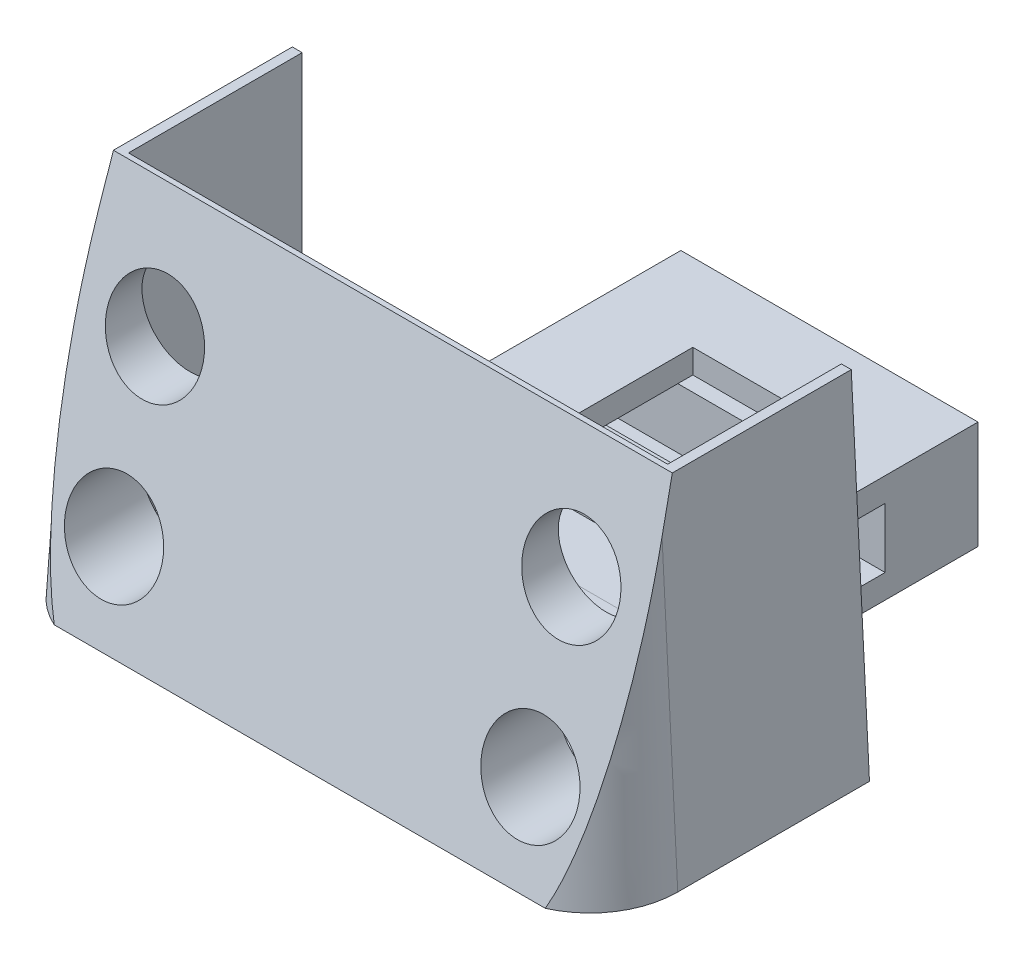
ISO-10303-21;
HEADER;
FILE_DESCRIPTION(('STEP AP214'),'2;1');
FILE_NAME('part.step','',(''),(''),'','','');
FILE_SCHEMA(('AUTOMOTIVE_DESIGN { 1 0 10303 214 1 1 1 1 }'));
ENDSEC;
DATA;
#1=APPLICATION_CONTEXT('core data for automotive mechanical design processes');
#2=APPLICATION_PROTOCOL_DEFINITION('international standard','automotive_design',2000,#1);
#3=PRODUCT_CONTEXT('',#1,'mechanical');
#4=PRODUCT('Part','Part','',(#3));
#5=PRODUCT_RELATED_PRODUCT_CATEGORY('part','',(#4));
#6=PRODUCT_DEFINITION_FORMATION('','',#4);
#7=PRODUCT_DEFINITION_CONTEXT('part definition',#1,'design');
#8=PRODUCT_DEFINITION('design','',#6,#7);
#9=PRODUCT_DEFINITION_SHAPE('','',#8);
#10=(LENGTH_UNIT() NAMED_UNIT(*) SI_UNIT(.MILLI.,.METRE.));
#11=(NAMED_UNIT(*) PLANE_ANGLE_UNIT() SI_UNIT($,.RADIAN.));
#12=(NAMED_UNIT(*) SI_UNIT($,.STERADIAN.) SOLID_ANGLE_UNIT());
#13=UNCERTAINTY_MEASURE_WITH_UNIT(LENGTH_MEASURE(1.E-05),#10,'distance_accuracy_value','');
#14=(GEOMETRIC_REPRESENTATION_CONTEXT(3) GLOBAL_UNCERTAINTY_ASSIGNED_CONTEXT((#13)) GLOBAL_UNIT_ASSIGNED_CONTEXT((#10,
#11,#12)) REPRESENTATION_CONTEXT('',''));
#15=CARTESIAN_POINT('',(0.,0.,0.));
#16=DIRECTION('',(0.,0.,1.));
#17=DIRECTION('',(1.,0.,0.));
#18=AXIS2_PLACEMENT_3D('',#15,#16,#17);
#19=CARTESIAN_POINT('',(-24.8,5.98999999999997,3.00000000000001));
#20=DIRECTION('',(0.,0.,1.));
#21=DIRECTION('',(1.,0.,0.));
#22=AXIS2_PLACEMENT_3D('',#19,#20,#21);
#23=PLANE('',#22);
#24=DIRECTION('',(0.,1.,0.));
#25=VECTOR('',#24,1.);
#26=CARTESIAN_POINT('',(24.8,0.,3.00000000000001));
#27=LINE('',#26,#25);
#28=CARTESIAN_POINT('',(24.8,5.99999999999999,3.00000000000001));
#29=VERTEX_POINT('',#28);
#30=CARTESIAN_POINT('',(24.8,10.,3.00000000000001));
#31=VERTEX_POINT('',#30);
#32=EDGE_CURVE('E58',#29,#31,#27,.T.);
#33=ORIENTED_EDGE('',*,*,#32,.T.);
#34=DIRECTION('',(-1.,0.,0.));
#35=VECTOR('',#34,1.);
#36=CARTESIAN_POINT('',(-35.,10.,3.00000000000001));
#37=LINE('',#36,#35);
#38=CARTESIAN_POINT('',(-24.8,10.,3.00000000000001));
#39=VERTEX_POINT('',#38);
#40=EDGE_CURVE('E187',#31,#39,#37,.T.);
#41=ORIENTED_EDGE('',*,*,#40,.T.);
#42=DIRECTION('',(0.,1.,0.));
#43=VECTOR('',#42,1.);
#44=CARTESIAN_POINT('',(-24.8,0.,3.00000000000001));
#45=LINE('',#44,#43);
#46=CARTESIAN_POINT('',(-24.8,5.99999999999999,3.00000000000001));
#47=VERTEX_POINT('',#46);
#48=EDGE_CURVE('E72',#47,#39,#45,.T.);
#49=ORIENTED_EDGE('',*,*,#48,.F.);
#50=DIRECTION('',(1.,0.,0.));
#51=VECTOR('',#50,1.);
#52=CARTESIAN_POINT('',(-50.,5.99999999999999,3.00000000000001));
#53=LINE('',#52,#51);
#54=EDGE_CURVE('E191',#47,#29,#53,.T.);
#55=ORIENTED_EDGE('',*,*,#54,.T.);
#56=EDGE_LOOP('',(#33,#41,#49,#55));
#57=FACE_BOUND('',#56,.T.);
#58=ADVANCED_FACE('F54',(#57),#23,.T.);
#59=CARTESIAN_POINT('',(-35.,10.,-35.));
#60=DIRECTION('',(0.,-1.,0.));
#61=DIRECTION('',(0.,0.,-1.));
#62=AXIS2_PLACEMENT_3D('',#59,#60,#61);
#63=PLANE('',#62);
#64=ORIENTED_EDGE('',*,*,#40,.F.);
#65=DIRECTION('',(0.,0.,-1.));
#66=VECTOR('',#65,1.);
#67=CARTESIAN_POINT('',(24.8,10.,3.));
#68=LINE('',#67,#66);
#69=CARTESIAN_POINT('',(24.8,10.,-7.49999999999999));
#70=VERTEX_POINT('',#69);
#71=EDGE_CURVE('E175',#31,#70,#68,.T.);
#72=ORIENTED_EDGE('',*,*,#71,.T.);
#73=DIRECTION('',(-1.,0.,0.));
#74=VECTOR('',#73,1.);
#75=CARTESIAN_POINT('',(15.,10.,-7.49999999999999));
#76=LINE('',#75,#74);
#77=CARTESIAN_POINT('',(-24.8,10.,-7.49999999999998));
#78=VERTEX_POINT('',#77);
#79=EDGE_CURVE('E222',#70,#78,#76,.T.);
#80=ORIENTED_EDGE('',*,*,#79,.T.);
#81=DIRECTION('',(0.,0.,1.));
#82=VECTOR('',#81,1.);
#83=CARTESIAN_POINT('',(-24.8,10.,3.));
#84=LINE('',#83,#82);
#85=EDGE_CURVE('E64',#78,#39,#84,.T.);
#86=ORIENTED_EDGE('',*,*,#85,.T.);
#87=EDGE_LOOP('',(#64,#72,#80,#86));
#88=FACE_BOUND('',#87,.T.);
#89=ADVANCED_FACE('F188',(#88),#63,.F.);
#90=CARTESIAN_POINT('',(-50.,6.,-40.));
#91=DIRECTION('',(0.,1.,0.));
#92=DIRECTION('',(0.,0.,1.));
#93=AXIS2_PLACEMENT_3D('',#90,#91,#92);
#94=PLANE('',#93);
#95=ORIENTED_EDGE('',*,*,#54,.F.);
#96=DIRECTION('',(0.,0.,1.));
#97=VECTOR('',#96,1.);
#98=CARTESIAN_POINT('',(-24.8,6.,-40.));
#99=LINE('',#98,#97);
#100=CARTESIAN_POINT('',(-24.8,6.00000000000001,-40.));
#101=VERTEX_POINT('',#100);
#102=EDGE_CURVE('E220',#101,#47,#99,.T.);
#103=ORIENTED_EDGE('',*,*,#102,.F.);
#104=DIRECTION('',(-1.,0.,0.));
#105=VECTOR('',#104,1.);
#106=CARTESIAN_POINT('',(-50.,6.00000000000001,-40.));
#107=LINE('',#106,#105);
#108=CARTESIAN_POINT('',(24.8,6.,-40.));
#109=VERTEX_POINT('',#108);
#110=EDGE_CURVE('E190',#109,#101,#107,.T.);
#111=ORIENTED_EDGE('',*,*,#110,.F.);
#112=DIRECTION('',(0.,0.,-1.));
#113=VECTOR('',#112,1.);
#114=CARTESIAN_POINT('',(24.8,6.,-40.));
#115=LINE('',#114,#113);
#116=EDGE_CURVE('E218',#29,#109,#115,.T.);
#117=ORIENTED_EDGE('',*,*,#116,.F.);
#118=EDGE_LOOP('',(#95,#103,#111,#117));
#119=FACE_BOUND('',#118,.T.);
#120=ADVANCED_FACE('F56',(#119),#94,.F.);
#121=CARTESIAN_POINT('',(-24.8,20.,-7.49999999999999));
#122=DIRECTION('',(0.,0.,-1.));
#123=DIRECTION('',(-1.,0.,0.));
#124=AXIS2_PLACEMENT_3D('',#121,#122,#123);
#125=PLANE('',#124);
#126=ORIENTED_EDGE('',*,*,#79,.F.);
#127=DIRECTION('',(0.,1.,0.));
#128=VECTOR('',#127,1.);
#129=CARTESIAN_POINT('',(24.8,-40.6992110392263,-7.5));
#130=LINE('',#129,#128);
#131=CARTESIAN_POINT('',(24.8,24.,-7.49999999999999));
#132=VERTEX_POINT('',#131);
#133=EDGE_CURVE('E183',#70,#132,#130,.T.);
#134=ORIENTED_EDGE('',*,*,#133,.T.);
#135=DIRECTION('',(-1.,0.,0.));
#136=VECTOR('',#135,1.);
#137=CARTESIAN_POINT('',(-24.8,24.,-7.49999999999999));
#138=LINE('',#137,#136);
#139=CARTESIAN_POINT('',(9.80000000000002,24.,-7.49999999999999));
#140=VERTEX_POINT('',#139);
#141=EDGE_CURVE('E212',#132,#140,#138,.T.);
#142=ORIENTED_EDGE('',*,*,#141,.T.);
#143=DIRECTION('',(0.,-1.,0.));
#144=VECTOR('',#143,1.);
#145=CARTESIAN_POINT('',(9.80000000000002,25.,-7.49999999999999));
#146=LINE('',#145,#144);
#147=CARTESIAN_POINT('',(9.80000000000002,20.,-7.49999999999999));
#148=VERTEX_POINT('',#147);
#149=EDGE_CURVE('E232',#140,#148,#146,.T.);
#150=ORIENTED_EDGE('',*,*,#149,.T.);
#151=DIRECTION('',(1.,0.,0.));
#152=VECTOR('',#151,1.);
#153=CARTESIAN_POINT('',(-24.8,20.,-7.49999999999999));
#154=LINE('',#153,#152);
#155=CARTESIAN_POINT('',(-9.8,20.,-7.49999999999999));
#156=VERTEX_POINT('',#155);
#157=EDGE_CURVE('E262',#156,#148,#154,.T.);
#158=ORIENTED_EDGE('',*,*,#157,.F.);
#159=DIRECTION('',(0.,-1.,0.));
#160=VECTOR('',#159,1.);
#161=CARTESIAN_POINT('',(-9.8,25.,-7.49999999999999));
#162=LINE('',#161,#160);
#163=CARTESIAN_POINT('',(-9.8,24.,-7.49999999999999));
#164=VERTEX_POINT('',#163);
#165=EDGE_CURVE('E252',#164,#156,#162,.T.);
#166=ORIENTED_EDGE('',*,*,#165,.F.);
#167=CARTESIAN_POINT('',(-24.8,24.,-7.49999999999998));
#168=VERTEX_POINT('',#167);
#169=EDGE_CURVE('E85',#164,#168,#138,.T.);
#170=ORIENTED_EDGE('',*,*,#169,.T.);
#171=DIRECTION('',(0.,1.,0.));
#172=VECTOR('',#171,1.);
#173=CARTESIAN_POINT('',(-24.8,-40.6992110392263,-7.49999999999999));
#174=LINE('',#173,#172);
#175=EDGE_CURVE('E12',#78,#168,#174,.T.);
#176=ORIENTED_EDGE('',*,*,#175,.F.);
#177=EDGE_LOOP('',(#126,#134,#142,#150,#158,#166,#170,#176));
#178=FACE_BOUND('',#177,.T.);
#179=ADVANCED_FACE('F301',(#178),#125,.F.);
#180=CARTESIAN_POINT('',(-24.8,89.2753352012447,-27.));
#181=DIRECTION('',(0.,0.,-1.));
#182=DIRECTION('',(-1.,0.,0.));
#183=AXIS2_PLACEMENT_3D('',#180,#181,#182);
#184=PLANE('',#183);
#185=DIRECTION('',(0.,1.,0.));
#186=VECTOR('',#185,1.);
#187=CARTESIAN_POINT('',(9.80000000000002,20.,-27.));
#188=LINE('',#187,#186);
#189=CARTESIAN_POINT('',(9.80000000000002,20.,-27.));
#190=VERTEX_POINT('',#189);
#191=CARTESIAN_POINT('',(9.80000000000002,24.,-27.));
#192=VERTEX_POINT('',#191);
#193=EDGE_CURVE('E224',#190,#192,#188,.T.);
#194=ORIENTED_EDGE('',*,*,#193,.T.);
#195=DIRECTION('',(-1.,0.,0.));
#196=VECTOR('',#195,1.);
#197=CARTESIAN_POINT('',(-24.8,24.,-27.));
#198=LINE('',#197,#196);
#199=CARTESIAN_POINT('',(-9.80000000000001,24.,-27.));
#200=VERTEX_POINT('',#199);
#201=EDGE_CURVE('E209',#192,#200,#198,.T.);
#202=ORIENTED_EDGE('',*,*,#201,.T.);
#203=DIRECTION('',(0.,-1.,0.));
#204=VECTOR('',#203,1.);
#205=CARTESIAN_POINT('',(-9.80000000000001,25.,-27.));
#206=LINE('',#205,#204);
#207=CARTESIAN_POINT('',(-9.80000000000001,20.,-27.));
#208=VERTEX_POINT('',#207);
#209=EDGE_CURVE('E227',#200,#208,#206,.T.);
#210=ORIENTED_EDGE('',*,*,#209,.T.);
#211=DIRECTION('',(1.,0.,0.));
#212=VECTOR('',#211,1.);
#213=CARTESIAN_POINT('',(-9.80000000000001,20.,-27.));
#214=LINE('',#213,#212);
#215=EDGE_CURVE('E229',#208,#190,#214,.T.);
#216=ORIENTED_EDGE('',*,*,#215,.T.);
#217=EDGE_LOOP('',(#194,#202,#210,#216));
#218=FACE_BOUND('',#217,.T.);
#219=ADVANCED_FACE('F346',(#218),#184,.F.);
#220=CARTESIAN_POINT('',(0.,20.,0.));
#221=DIRECTION('',(0.,1.,0.));
#222=DIRECTION('',(0.,0.,1.));
#223=AXIS2_PLACEMENT_3D('',#220,#221,#222);
#224=PLANE('',#223);
#225=DIRECTION('',(0.,0.,1.));
#226=VECTOR('',#225,1.);
#227=CARTESIAN_POINT('',(9.80000000000002,20.,-29.5));
#228=LINE('',#227,#226);
#229=CARTESIAN_POINT('',(9.80000000000002,20.,-24.5));
#230=VERTEX_POINT('',#229);
#231=EDGE_CURVE('E235',#190,#230,#228,.T.);
#232=ORIENTED_EDGE('',*,*,#231,.F.);
#233=ORIENTED_EDGE('',*,*,#215,.F.);
#234=DIRECTION('',(0.,0.,-1.));
#235=VECTOR('',#234,1.);
#236=CARTESIAN_POINT('',(-9.80000000000001,20.,-29.5));
#237=LINE('',#236,#235);
#238=CARTESIAN_POINT('',(-9.80000000000001,20.,-24.5));
#239=VERTEX_POINT('',#238);
#240=EDGE_CURVE('E247',#239,#208,#237,.T.);
#241=ORIENTED_EDGE('',*,*,#240,.F.);
#242=DIRECTION('',(1.,0.,0.));
#243=VECTOR('',#242,1.);
#244=CARTESIAN_POINT('',(-24.8,20.,-24.5));
#245=LINE('',#244,#243);
#246=EDGE_CURVE('E273',#239,#230,#245,.T.);
#247=ORIENTED_EDGE('',*,*,#246,.T.);
#248=EDGE_LOOP('',(#232,#233,#241,#247));
#249=FACE_BOUND('',#248,.T.);
#250=ADVANCED_FACE('F344',(#249),#224,.T.);
#251=CARTESIAN_POINT('',(-9.80000000000001,25.,-29.5));
#252=DIRECTION('',(-1.,0.,0.));
#253=DIRECTION('',(0.,0.,1.));
#254=AXIS2_PLACEMENT_3D('',#251,#252,#253);
#255=PLANE('',#254);
#256=ORIENTED_EDGE('',*,*,#209,.F.);
#257=DIRECTION('',(0.,0.,1.));
#258=VECTOR('',#257,1.);
#259=CARTESIAN_POINT('',(-9.80000000000001,24.,-29.5));
#260=LINE('',#259,#258);
#261=EDGE_CURVE('E215',#200,#164,#260,.T.);
#262=ORIENTED_EDGE('',*,*,#261,.T.);
#263=ORIENTED_EDGE('',*,*,#165,.T.);
#264=CARTESIAN_POINT('',(-9.8,20.,-12.5));
#265=VERTEX_POINT('',#264);
#266=EDGE_CURVE('E248',#156,#265,#237,.T.);
#267=ORIENTED_EDGE('',*,*,#266,.T.);
#268=EDGE_CURVE('E251',#265,#239,#237,.T.);
#269=ORIENTED_EDGE('',*,*,#268,.T.);
#270=ORIENTED_EDGE('',*,*,#240,.T.);
#271=EDGE_LOOP('',(#256,#262,#263,#267,#269,#270));
#272=FACE_BOUND('',#271,.T.);
#273=ADVANCED_FACE('F304',(#272),#255,.F.);
#274=CARTESIAN_POINT('',(9.80000000000002,25.,-29.5));
#275=DIRECTION('',(1.,0.,0.));
#276=DIRECTION('',(0.,0.,-1.));
#277=AXIS2_PLACEMENT_3D('',#274,#275,#276);
#278=PLANE('',#277);
#279=ORIENTED_EDGE('',*,*,#149,.F.);
#280=DIRECTION('',(0.,0.,-1.));
#281=VECTOR('',#280,1.);
#282=CARTESIAN_POINT('',(9.80000000000002,24.,-29.5));
#283=LINE('',#282,#281);
#284=EDGE_CURVE('E206',#140,#192,#283,.T.);
#285=ORIENTED_EDGE('',*,*,#284,.T.);
#286=ORIENTED_EDGE('',*,*,#193,.F.);
#287=ORIENTED_EDGE('',*,*,#231,.T.);
#288=CARTESIAN_POINT('',(9.80000000000002,20.,-12.5));
#289=VERTEX_POINT('',#288);
#290=EDGE_CURVE('E237',#230,#289,#228,.T.);
#291=ORIENTED_EDGE('',*,*,#290,.T.);
#292=EDGE_CURVE('E234',#289,#148,#228,.T.);
#293=ORIENTED_EDGE('',*,*,#292,.T.);
#294=EDGE_LOOP('',(#279,#285,#286,#287,#291,#293));
#295=FACE_BOUND('',#294,.T.);
#296=ADVANCED_FACE('F314',(#295),#278,.F.);
#297=CARTESIAN_POINT('',(0.,20.,0.));
#298=DIRECTION('',(0.,1.,0.));
#299=DIRECTION('',(0.,0.,1.));
#300=AXIS2_PLACEMENT_3D('',#297,#298,#299);
#301=PLANE('',#300);
#302=ORIENTED_EDGE('',*,*,#157,.T.);
#303=ORIENTED_EDGE('',*,*,#292,.F.);
#304=DIRECTION('',(-1.,0.,0.));
#305=VECTOR('',#304,1.);
#306=CARTESIAN_POINT('',(-24.8,20.,-12.5));
#307=LINE('',#306,#305);
#308=EDGE_CURVE('E267',#289,#265,#307,.T.);
#309=ORIENTED_EDGE('',*,*,#308,.T.);
#310=ORIENTED_EDGE('',*,*,#266,.F.);
#311=EDGE_LOOP('',(#302,#303,#309,#310));
#312=FACE_BOUND('',#311,.T.);
#313=ADVANCED_FACE('F311',(#312),#301,.T.);
#314=DIRECTION('',(-1.,0.,0.));
#315=VECTOR('',#314,1.);
#316=CARTESIAN_POINT('',(-24.8,10.,-12.5));
#317=LINE('',#316,#315);
#318=CARTESIAN_POINT('',(24.8,10.,-12.5));
#319=VERTEX_POINT('',#318);
#320=CARTESIAN_POINT('',(-24.8,10.,-12.5));
#321=VERTEX_POINT('',#320);
#322=EDGE_CURVE('E259',#319,#321,#317,.T.);
#323=ORIENTED_EDGE('',*,*,#322,.F.);
#324=DIRECTION('',(0.,0.,1.));
#325=VECTOR('',#324,1.);
#326=CARTESIAN_POINT('',(24.8,10.,-40.));
#327=LINE('',#326,#325);
#328=CARTESIAN_POINT('',(24.8,10.,-24.5));
#329=VERTEX_POINT('',#328);
#330=EDGE_CURVE('E284',#329,#319,#327,.T.);
#331=ORIENTED_EDGE('',*,*,#330,.F.);
#332=DIRECTION('',(1.,0.,0.));
#333=VECTOR('',#332,1.);
#334=CARTESIAN_POINT('',(-24.8,10.,-24.5));
#335=LINE('',#334,#333);
#336=CARTESIAN_POINT('',(-24.8,10.,-24.5));
#337=VERTEX_POINT('',#336);
#338=EDGE_CURVE('E263',#337,#329,#335,.T.);
#339=ORIENTED_EDGE('',*,*,#338,.F.);
#340=DIRECTION('',(0.,0.,-1.));
#341=VECTOR('',#340,1.);
#342=CARTESIAN_POINT('',(-24.8,10.,-40.));
#343=LINE('',#342,#341);
#344=EDGE_CURVE('E282',#321,#337,#343,.T.);
#345=ORIENTED_EDGE('',*,*,#344,.F.);
#346=EDGE_LOOP('',(#323,#331,#339,#345));
#347=FACE_BOUND('',#346,.T.);
#348=ADVANCED_FACE('F337',(#347),#63,.F.);
#349=CARTESIAN_POINT('',(24.8,0.,-40.));
#350=DIRECTION('',(-1.,0.,0.));
#351=DIRECTION('',(0.,0.,1.));
#352=AXIS2_PLACEMENT_3D('',#349,#350,#351);
#353=PLANE('',#352);
#354=ORIENTED_EDGE('',*,*,#133,.F.);
#355=ORIENTED_EDGE('',*,*,#71,.F.);
#356=ORIENTED_EDGE('',*,*,#32,.F.);
#357=ORIENTED_EDGE('',*,*,#116,.T.);
#358=DIRECTION('',(0.,1.,0.));
#359=VECTOR('',#358,1.);
#360=CARTESIAN_POINT('',(24.8,0.,-40.));
#361=LINE('',#360,#359);
#362=CARTESIAN_POINT('',(24.8,24.,-40.));
#363=VERTEX_POINT('',#362);
#364=EDGE_CURVE('E281',#109,#363,#361,.T.);
#365=ORIENTED_EDGE('',*,*,#364,.T.);
#366=DIRECTION('',(0.,0.,1.));
#367=VECTOR('',#366,1.);
#368=CARTESIAN_POINT('',(24.8,24.,-40.));
#369=LINE('',#368,#367);
#370=EDGE_CURVE('E204',#363,#132,#369,.T.);
#371=ORIENTED_EDGE('',*,*,#370,.T.);
#372=EDGE_LOOP('',(#354,#355,#356,#357,#365,#371));
#373=FACE_BOUND('',#372,.T.);
#374=DIRECTION('',(0.,0.,-1.));
#375=VECTOR('',#374,1.);
#376=CARTESIAN_POINT('',(24.8,20.,-29.5));
#377=LINE('',#376,#375);
#378=CARTESIAN_POINT('',(24.8,20.,-12.5));
#379=VERTEX_POINT('',#378);
#380=CARTESIAN_POINT('',(24.8,20.,-24.5));
#381=VERTEX_POINT('',#380);
#382=EDGE_CURVE('E238',#379,#381,#377,.T.);
#383=ORIENTED_EDGE('',*,*,#382,.T.);
#384=DIRECTION('',(0.,-1.,0.));
#385=VECTOR('',#384,1.);
#386=CARTESIAN_POINT('',(24.8,20.,-24.5));
#387=LINE('',#386,#385);
#388=EDGE_CURVE('E274',#381,#329,#387,.T.);
#389=ORIENTED_EDGE('',*,*,#388,.T.);
#390=ORIENTED_EDGE('',*,*,#330,.T.);
#391=DIRECTION('',(0.,-1.,0.));
#392=VECTOR('',#391,1.);
#393=CARTESIAN_POINT('',(24.8,20.,-12.5));
#394=LINE('',#393,#392);
#395=EDGE_CURVE('E254',#379,#319,#394,.T.);
#396=ORIENTED_EDGE('',*,*,#395,.F.);
#397=EDGE_LOOP('',(#383,#389,#390,#396));
#398=FACE_BOUND('',#397,.T.);
#399=ADVANCED_FACE('F177',(#373,#398),#353,.F.);
#400=CARTESIAN_POINT('',(-24.8,0.,-40.));
#401=DIRECTION('',(1.,0.,0.));
#402=DIRECTION('',(0.,0.,-1.));
#403=AXIS2_PLACEMENT_3D('',#400,#401,#402);
#404=PLANE('',#403);
#405=ORIENTED_EDGE('',*,*,#48,.T.);
#406=ORIENTED_EDGE('',*,*,#85,.F.);
#407=ORIENTED_EDGE('',*,*,#175,.T.);
#408=DIRECTION('',(0.,0.,-1.));
#409=VECTOR('',#408,1.);
#410=CARTESIAN_POINT('',(-24.8,24.,-40.));
#411=LINE('',#410,#409);
#412=CARTESIAN_POINT('',(-24.8,24.,-40.));
#413=VERTEX_POINT('',#412);
#414=EDGE_CURVE('E91',#168,#413,#411,.T.);
#415=ORIENTED_EDGE('',*,*,#414,.T.);
#416=DIRECTION('',(0.,1.,0.));
#417=VECTOR('',#416,1.);
#418=CARTESIAN_POINT('',(-24.8,0.,-40.));
#419=LINE('',#418,#417);
#420=EDGE_CURVE('E196',#101,#413,#419,.T.);
#421=ORIENTED_EDGE('',*,*,#420,.F.);
#422=ORIENTED_EDGE('',*,*,#102,.T.);
#423=EDGE_LOOP('',(#405,#406,#407,#415,#421,#422));
#424=FACE_BOUND('',#423,.T.);
#425=DIRECTION('',(0.,-1.,0.));
#426=VECTOR('',#425,1.);
#427=CARTESIAN_POINT('',(-24.8,20.,-24.5));
#428=LINE('',#427,#426);
#429=CARTESIAN_POINT('',(-24.8,20.,-24.5));
#430=VERTEX_POINT('',#429);
#431=EDGE_CURVE('E278',#430,#337,#428,.T.);
#432=ORIENTED_EDGE('',*,*,#431,.F.);
#433=DIRECTION('',(0.,0.,1.));
#434=VECTOR('',#433,1.);
#435=CARTESIAN_POINT('',(-24.8,20.,-29.5));
#436=LINE('',#435,#434);
#437=CARTESIAN_POINT('',(-24.8,20.,-12.5));
#438=VERTEX_POINT('',#437);
#439=EDGE_CURVE('E244',#430,#438,#436,.T.);
#440=ORIENTED_EDGE('',*,*,#439,.T.);
#441=DIRECTION('',(0.,-1.,0.));
#442=VECTOR('',#441,1.);
#443=CARTESIAN_POINT('',(-24.8,20.,-12.5));
#444=LINE('',#443,#442);
#445=EDGE_CURVE('E256',#438,#321,#444,.T.);
#446=ORIENTED_EDGE('',*,*,#445,.T.);
#447=ORIENTED_EDGE('',*,*,#344,.T.);
#448=EDGE_LOOP('',(#432,#440,#446,#447));
#449=FACE_BOUND('',#448,.T.);
#450=ADVANCED_FACE('F296',(#424,#449),#404,.F.);
#451=CARTESIAN_POINT('',(-24.8,20.,-24.5));
#452=DIRECTION('',(0.,0.,-1.));
#453=DIRECTION('',(-1.,0.,0.));
#454=AXIS2_PLACEMENT_3D('',#451,#452,#453);
#455=PLANE('',#454);
#456=ORIENTED_EDGE('',*,*,#338,.T.);
#457=ORIENTED_EDGE('',*,*,#388,.F.);
#458=DIRECTION('',(-1.,0.,0.));
#459=VECTOR('',#458,1.);
#460=CARTESIAN_POINT('',(-24.8,20.,-24.5));
#461=LINE('',#460,#459);
#462=EDGE_CURVE('E241',#381,#230,#461,.T.);
#463=ORIENTED_EDGE('',*,*,#462,.T.);
#464=ORIENTED_EDGE('',*,*,#246,.F.);
#465=EDGE_CURVE('E270',#430,#239,#245,.T.);
#466=ORIENTED_EDGE('',*,*,#465,.F.);
#467=ORIENTED_EDGE('',*,*,#431,.T.);
#468=EDGE_LOOP('',(#456,#457,#463,#464,#466,#467));
#469=FACE_BOUND('',#468,.T.);
#470=ADVANCED_FACE('F339',(#469),#455,.F.);
#471=CARTESIAN_POINT('',(-24.8,20.,-12.5));
#472=DIRECTION('',(0.,0.,1.));
#473=DIRECTION('',(1.,0.,0.));
#474=AXIS2_PLACEMENT_3D('',#471,#472,#473);
#475=PLANE('',#474);
#476=ORIENTED_EDGE('',*,*,#322,.T.);
#477=ORIENTED_EDGE('',*,*,#445,.F.);
#478=EDGE_CURVE('E258',#265,#438,#307,.T.);
#479=ORIENTED_EDGE('',*,*,#478,.F.);
#480=ORIENTED_EDGE('',*,*,#308,.F.);
#481=EDGE_CURVE('E264',#379,#289,#307,.T.);
#482=ORIENTED_EDGE('',*,*,#481,.F.);
#483=ORIENTED_EDGE('',*,*,#395,.T.);
#484=EDGE_LOOP('',(#476,#477,#479,#480,#482,#483));
#485=FACE_BOUND('',#484,.T.);
#486=ADVANCED_FACE('F323',(#485),#475,.F.);
#487=CARTESIAN_POINT('',(0.,20.,0.));
#488=DIRECTION('',(0.,1.,0.));
#489=DIRECTION('',(0.,0.,1.));
#490=AXIS2_PLACEMENT_3D('',#487,#488,#489);
#491=PLANE('',#490);
#492=ORIENTED_EDGE('',*,*,#439,.F.);
#493=ORIENTED_EDGE('',*,*,#465,.T.);
#494=ORIENTED_EDGE('',*,*,#268,.F.);
#495=ORIENTED_EDGE('',*,*,#478,.T.);
#496=EDGE_LOOP('',(#492,#493,#494,#495));
#497=FACE_BOUND('',#496,.T.);
#498=ADVANCED_FACE('F330',(#497),#491,.F.);
#499=CARTESIAN_POINT('',(0.,20.,0.));
#500=DIRECTION('',(0.,-1.,0.));
#501=DIRECTION('',(0.,0.,-1.));
#502=AXIS2_PLACEMENT_3D('',#499,#500,#501);
#503=PLANE('',#502);
#504=ORIENTED_EDGE('',*,*,#462,.F.);
#505=ORIENTED_EDGE('',*,*,#382,.F.);
#506=ORIENTED_EDGE('',*,*,#481,.T.);
#507=ORIENTED_EDGE('',*,*,#290,.F.);
#508=EDGE_LOOP('',(#504,#505,#506,#507));
#509=FACE_BOUND('',#508,.T.);
#510=ADVANCED_FACE('F319',(#509),#503,.T.);
#511=CARTESIAN_POINT('',(-50.,-101.980390271856,-40.));
#512=DIRECTION('',(0.,0.,1.));
#513=DIRECTION('',(1.,0.,0.));
#514=AXIS2_PLACEMENT_3D('',#511,#512,#513);
#515=PLANE('',#514);
#516=ORIENTED_EDGE('',*,*,#420,.T.);
#517=DIRECTION('',(1.,0.,0.));
#518=VECTOR('',#517,1.);
#519=CARTESIAN_POINT('',(-49.6855533243016,24.,-40.));
#520=LINE('',#519,#518);
#521=EDGE_CURVE('E200',#413,#363,#520,.T.);
#522=ORIENTED_EDGE('',*,*,#521,.T.);
#523=ORIENTED_EDGE('',*,*,#364,.F.);
#524=ORIENTED_EDGE('',*,*,#110,.T.);
#525=EDGE_LOOP('',(#516,#522,#523,#524));
#526=FACE_BOUND('',#525,.T.);
#527=ADVANCED_FACE('F294',(#526),#515,.F.);
#528=CARTESIAN_POINT('',(-49.6855533243016,24.,-40.));
#529=DIRECTION('',(0.,-1.,0.));
#530=DIRECTION('',(0.,0.,-1.));
#531=AXIS2_PLACEMENT_3D('',#528,#529,#530);
#532=PLANE('',#531);
#533=ORIENTED_EDGE('',*,*,#414,.F.);
#534=ORIENTED_EDGE('',*,*,#169,.F.);
#535=ORIENTED_EDGE('',*,*,#261,.F.);
#536=ORIENTED_EDGE('',*,*,#201,.F.);
#537=ORIENTED_EDGE('',*,*,#284,.F.);
#538=ORIENTED_EDGE('',*,*,#141,.F.);
#539=ORIENTED_EDGE('',*,*,#370,.F.);
#540=ORIENTED_EDGE('',*,*,#521,.F.);
#541=EDGE_LOOP('',(#533,#534,#535,#536,#537,#538,#539,#540));
#542=FACE_BOUND('',#541,.T.);
#543=ADVANCED_FACE('F299',(#542),#532,.F.);
#544=CLOSED_SHELL('',(#58,#89,#120,#179,#219,#250,#273,#296,#313,#348,#399,#450,#470,#486,#498,
#510,#527,#543));
#545=MANIFOLD_SOLID_BREP('B2',#544);
#546=CARTESIAN_POINT('',(34.75,45.5,50.));
#547=DIRECTION('',(0.,0.,-1.));
#548=DIRECTION('',(-1.,0.,0.));
#549=AXIS2_PLACEMENT_3D('',#546,#547,#548);
#550=CYLINDRICAL_SURFACE('',#549,8.);
#551=CARTESIAN_POINT('',(34.75,45.5,37.8272168333866));
#552=DIRECTION('',(0.,-0.258819045102516,-0.96592582628907));
#553=DIRECTION('',(0.,0.96592582628907,-0.258819045102516));
#554=AXIS2_PLACEMENT_3D('',#551,#552,#553);
#555=ELLIPSE('',#554,8.28220944328066,8.);
#556=CARTESIAN_POINT('',(34.75,53.5,35.6836232939376));
#557=VERTEX_POINT('',#556);
#558=EDGE_CURVE('E717',#557,#557,#555,.F.);
#559=ORIENTED_EDGE('',*,*,#558,.T.);
#560=EDGE_LOOP('',(#559));
#561=FACE_BOUND('',#560,.T.);
#562=CARTESIAN_POINT('',(34.75,45.5,32.));
#563=DIRECTION('',(0.,0.,-1.));
#564=DIRECTION('',(-1.,0.,0.));
#565=AXIS2_PLACEMENT_3D('',#562,#563,#564);
#566=CIRCLE('',#565,8.);
#567=CARTESIAN_POINT('',(26.75,45.5,32.));
#568=VERTEX_POINT('',#567);
#569=EDGE_CURVE('E721',#568,#568,#566,.T.);
#570=ORIENTED_EDGE('',*,*,#569,.T.);
#571=EDGE_LOOP('',(#570));
#572=FACE_BOUND('',#571,.T.);
#573=ADVANCED_FACE('F608',(#561,#572),#550,.F.);
#574=CARTESIAN_POINT('',(-34.75,20.,50.));
#575=DIRECTION('',(0.,0.,-1.));
#576=DIRECTION('',(-1.,0.,0.));
#577=AXIS2_PLACEMENT_3D('',#574,#575,#576);
#578=CYLINDRICAL_SURFACE('',#577,8.);
#579=CARTESIAN_POINT('',(-34.75,20.,44.6599212403801));
#580=DIRECTION('',(0.,-0.258819045102516,-0.96592582628907));
#581=DIRECTION('',(0.,0.96592582628907,-0.258819045102516));
#582=AXIS2_PLACEMENT_3D('',#579,#580,#581);
#583=ELLIPSE('',#582,8.28220944328065,8.);
#584=CARTESIAN_POINT('',(-34.75,28.,42.5163277009311));
#585=VERTEX_POINT('',#584);
#586=EDGE_CURVE('E720',#585,#585,#583,.F.);
#587=ORIENTED_EDGE('',*,*,#586,.T.);
#588=EDGE_LOOP('',(#587));
#589=FACE_BOUND('',#588,.T.);
#590=CARTESIAN_POINT('',(-34.75,20.,32.));
#591=DIRECTION('',(0.,0.,-1.));
#592=DIRECTION('',(-1.,0.,0.));
#593=AXIS2_PLACEMENT_3D('',#590,#591,#592);
#594=CIRCLE('',#593,8.);
#595=CARTESIAN_POINT('',(-42.75,20.,32.));
#596=VERTEX_POINT('',#595);
#597=EDGE_CURVE('E753',#596,#596,#594,.T.);
#598=ORIENTED_EDGE('',*,*,#597,.T.);
#599=EDGE_LOOP('',(#598));
#600=FACE_BOUND('',#599,.T.);
#601=ADVANCED_FACE('F817',(#589,#600),#578,.F.);
#602=CARTESIAN_POINT('',(34.75,20.,50.));
#603=DIRECTION('',(0.,0.,-1.));
#604=DIRECTION('',(-1.,0.,0.));
#605=AXIS2_PLACEMENT_3D('',#602,#603,#604);
#606=CYLINDRICAL_SURFACE('',#605,8.);
#607=CARTESIAN_POINT('',(34.75,20.,44.6599212403801));
#608=DIRECTION('',(0.,-0.258819045102516,-0.96592582628907));
#609=DIRECTION('',(0.,0.96592582628907,-0.258819045102516));
#610=AXIS2_PLACEMENT_3D('',#607,#608,#609);
#611=ELLIPSE('',#610,8.28220944328066,8.);
#612=CARTESIAN_POINT('',(34.75,28.,42.5163277009311));
#613=VERTEX_POINT('',#612);
#614=EDGE_CURVE('E724',#613,#613,#611,.F.);
#615=ORIENTED_EDGE('',*,*,#614,.T.);
#616=EDGE_LOOP('',(#615));
#617=FACE_BOUND('',#616,.T.);
#618=CARTESIAN_POINT('',(34.75,20.,32.));
#619=DIRECTION('',(0.,0.,-1.));
#620=DIRECTION('',(-1.,0.,0.));
#621=AXIS2_PLACEMENT_3D('',#618,#619,#620);
#622=CIRCLE('',#621,8.);
#623=CARTESIAN_POINT('',(26.75,20.,32.));
#624=VERTEX_POINT('',#623);
#625=EDGE_CURVE('E756',#624,#624,#622,.T.);
#626=ORIENTED_EDGE('',*,*,#625,.T.);
#627=EDGE_LOOP('',(#626));
#628=FACE_BOUND('',#627,.T.);
#629=ADVANCED_FACE('F820',(#617,#628),#606,.F.);
#630=CARTESIAN_POINT('',(-34.75,45.5,50.));
#631=DIRECTION('',(0.,0.,-1.));
#632=DIRECTION('',(-1.,0.,0.));
#633=AXIS2_PLACEMENT_3D('',#630,#631,#632);
#634=CYLINDRICAL_SURFACE('',#633,8.);
#635=CARTESIAN_POINT('',(-34.75,45.5,37.8272168333866));
#636=DIRECTION('',(0.,-0.258819045102516,-0.96592582628907));
#637=DIRECTION('',(0.,0.96592582628907,-0.258819045102516));
#638=AXIS2_PLACEMENT_3D('',#635,#636,#637);
#639=ELLIPSE('',#638,8.28220944328065,8.);
#640=CARTESIAN_POINT('',(-34.75,53.5,35.6836232939376));
#641=VERTEX_POINT('',#640);
#642=EDGE_CURVE('E727',#641,#641,#639,.F.);
#643=ORIENTED_EDGE('',*,*,#642,.T.);
#644=EDGE_LOOP('',(#643));
#645=FACE_BOUND('',#644,.T.);
#646=CARTESIAN_POINT('',(-34.75,45.5,32.));
#647=DIRECTION('',(0.,0.,-1.));
#648=DIRECTION('',(-1.,0.,0.));
#649=AXIS2_PLACEMENT_3D('',#646,#647,#648);
#650=CIRCLE('',#649,8.);
#651=CARTESIAN_POINT('',(-42.75,45.5,32.));
#652=VERTEX_POINT('',#651);
#653=EDGE_CURVE('E757',#652,#652,#650,.T.);
#654=ORIENTED_EDGE('',*,*,#653,.T.);
#655=EDGE_LOOP('',(#654));
#656=FACE_BOUND('',#655,.T.);
#657=ADVANCED_FACE('F822',(#645,#656),#634,.F.);
#658=CARTESIAN_POINT('',(-40.,25.,32.));
#659=DIRECTION('',(0.,0.,-1.));
#660=DIRECTION('',(-1.,0.,0.));
#661=AXIS2_PLACEMENT_3D('',#658,#659,#660);
#662=PLANE('',#661);
#663=ORIENTED_EDGE('',*,*,#653,.F.);
#664=EDGE_LOOP('',(#663));
#665=FACE_BOUND('',#664,.T.);
#666=ORIENTED_EDGE('',*,*,#625,.F.);
#667=EDGE_LOOP('',(#666));
#668=FACE_BOUND('',#667,.T.);
#669=ORIENTED_EDGE('',*,*,#597,.F.);
#670=EDGE_LOOP('',(#669));
#671=FACE_BOUND('',#670,.T.);
#672=ORIENTED_EDGE('',*,*,#569,.F.);
#673=EDGE_LOOP('',(#672));
#674=FACE_BOUND('',#673,.T.);
#675=DIRECTION('',(0.,-1.,0.));
#676=VECTOR('',#675,1.);
#677=CARTESIAN_POINT('',(45.,64.,32.));
#678=LINE('',#677,#676);
#679=CARTESIAN_POINT('',(45.,64.,32.));
#680=VERTEX_POINT('',#679);
#681=CARTESIAN_POINT('',(45.,9.99999999999999,32.));
#682=VERTEX_POINT('',#681);
#683=EDGE_CURVE('E776',#680,#682,#678,.T.);
#684=ORIENTED_EDGE('',*,*,#683,.T.);
#685=DIRECTION('',(1.,0.,0.));
#686=VECTOR('',#685,1.);
#687=CARTESIAN_POINT('',(-40.,10.,32.));
#688=LINE('',#687,#686);
#689=CARTESIAN_POINT('',(-45.,9.99999999999999,32.));
#690=VERTEX_POINT('',#689);
#691=EDGE_CURVE('E784',#690,#682,#688,.T.);
#692=ORIENTED_EDGE('',*,*,#691,.F.);
#693=DIRECTION('',(0.,-1.,0.));
#694=VECTOR('',#693,1.);
#695=CARTESIAN_POINT('',(-45.,64.,32.));
#696=LINE('',#695,#694);
#697=CARTESIAN_POINT('',(-45.,64.,32.));
#698=VERTEX_POINT('',#697);
#699=EDGE_CURVE('E773',#698,#690,#696,.T.);
#700=ORIENTED_EDGE('',*,*,#699,.F.);
#701=DIRECTION('',(1.,0.,0.));
#702=VECTOR('',#701,1.);
#703=CARTESIAN_POINT('',(45.,64.,32.));
#704=LINE('',#703,#702);
#705=EDGE_CURVE('E765',#698,#680,#704,.T.);
#706=ORIENTED_EDGE('',*,*,#705,.T.);
#707=EDGE_LOOP('',(#684,#692,#700,#706));
#708=FACE_BOUND('',#707,.T.);
#709=ADVANCED_FACE('F825',(#665,#668,#671,#674,#708),#662,.T.);
#710=CARTESIAN_POINT('',(-45.,166.42135623731,37.));
#711=DIRECTION('',(1.,0.,0.));
#712=DIRECTION('',(0.,0.,-1.));
#713=AXIS2_PLACEMENT_3D('',#710,#711,#712);
#714=PLANE('',#713);
#715=DIRECTION('',(0.,-1.,0.));
#716=VECTOR('',#715,1.);
#717=CARTESIAN_POINT('',(-45.,166.42135623731,3.00000000000001));
#718=LINE('',#717,#716);
#719=CARTESIAN_POINT('',(-45.,64.,3.00000000000001));
#720=VERTEX_POINT('',#719);
#721=CARTESIAN_POINT('',(-45.,10.,3.00000000000001));
#722=VERTEX_POINT('',#721);
#723=EDGE_CURVE('E750',#720,#722,#718,.T.);
#724=ORIENTED_EDGE('',*,*,#723,.F.);
#725=DIRECTION('',(0.,0.,1.));
#726=VECTOR('',#725,1.);
#727=CARTESIAN_POINT('',(-45.,64.,-35.));
#728=LINE('',#727,#726);
#729=EDGE_CURVE('E771',#720,#698,#728,.T.);
#730=ORIENTED_EDGE('',*,*,#729,.T.);
#731=ORIENTED_EDGE('',*,*,#699,.T.);
#732=DIRECTION('',(0.,0.,1.));
#733=VECTOR('',#732,1.);
#734=CARTESIAN_POINT('',(-45.,10.,37.));
#735=LINE('',#734,#733);
#736=EDGE_CURVE('E779',#722,#690,#735,.T.);
#737=ORIENTED_EDGE('',*,*,#736,.F.);
#738=EDGE_LOOP('',(#724,#730,#731,#737));
#739=FACE_BOUND('',#738,.T.);
#740=ADVANCED_FACE('F836',(#739),#714,.T.);
#741=CARTESIAN_POINT('',(-35.,64.,-35.));
#742=DIRECTION('',(0.,1.,0.));
#743=DIRECTION('',(0.,0.,1.));
#744=AXIS2_PLACEMENT_3D('',#741,#742,#743);
#745=PLANE('',#744);
#746=DIRECTION('',(-1.,0.,0.));
#747=VECTOR('',#746,1.);
#748=CARTESIAN_POINT('',(-42.,64.,3.00000000000001));
#749=LINE('',#748,#747);
#750=CARTESIAN_POINT('',(-46.6459021258853,64.,3.00000000000001));
#751=VERTEX_POINT('',#750);
#752=EDGE_CURVE('E744',#720,#751,#749,.T.);
#753=ORIENTED_EDGE('',*,*,#752,.T.);
#754=DIRECTION('',(0.,0.,1.));
#755=VECTOR('',#754,1.);
#756=CARTESIAN_POINT('',(-46.6459021258853,64.,35.));
#757=LINE('',#756,#755);
#758=CARTESIAN_POINT('',(-46.6459021258853,64.,32.8701567734109));
#759=VERTEX_POINT('',#758);
#760=EDGE_CURVE('E786',#751,#759,#757,.T.);
#761=ORIENTED_EDGE('',*,*,#760,.T.);
#762=DIRECTION('',(1.,0.,0.));
#763=VECTOR('',#762,1.);
#764=CARTESIAN_POINT('',(-35.,64.,32.8701567734109));
#765=LINE('',#764,#763);
#766=CARTESIAN_POINT('',(46.6459021258853,64.,32.8701567734109));
#767=VERTEX_POINT('',#766);
#768=EDGE_CURVE('E711',#759,#767,#765,.T.);
#769=ORIENTED_EDGE('',*,*,#768,.T.);
#770=DIRECTION('',(0.,0.,-1.));
#771=VECTOR('',#770,1.);
#772=CARTESIAN_POINT('',(46.6459021258853,64.,-35.));
#773=LINE('',#772,#771);
#774=CARTESIAN_POINT('',(46.6459021258853,64.,3.00000000000004));
#775=VERTEX_POINT('',#774);
#776=EDGE_CURVE('E788',#767,#775,#773,.T.);
#777=ORIENTED_EDGE('',*,*,#776,.T.);
#778=DIRECTION('',(-1.,0.,0.));
#779=VECTOR('',#778,1.);
#780=CARTESIAN_POINT('',(42.,64.,3.00000000000004));
#781=LINE('',#780,#779);
#782=CARTESIAN_POINT('',(45.,64.,3.00000000000004));
#783=VERTEX_POINT('',#782);
#784=EDGE_CURVE('E624',#775,#783,#781,.T.);
#785=ORIENTED_EDGE('',*,*,#784,.T.);
#786=DIRECTION('',(0.,0.,-1.));
#787=VECTOR('',#786,1.);
#788=CARTESIAN_POINT('',(45.,64.,32.));
#789=LINE('',#788,#787);
#790=EDGE_CURVE('E767',#680,#783,#789,.T.);
#791=ORIENTED_EDGE('',*,*,#790,.F.);
#792=ORIENTED_EDGE('',*,*,#705,.F.);
#793=ORIENTED_EDGE('',*,*,#729,.F.);
#794=EDGE_LOOP('',(#753,#761,#769,#777,#785,#791,#792,#793));
#795=FACE_BOUND('',#794,.T.);
#796=ADVANCED_FACE('F794',(#795),#745,.T.);
#797=CARTESIAN_POINT('',(45.,166.42135623731,37.));
#798=DIRECTION('',(-1.,0.,0.));
#799=DIRECTION('',(0.,0.,1.));
#800=AXIS2_PLACEMENT_3D('',#797,#798,#799);
#801=PLANE('',#800);
#802=DIRECTION('',(0.,1.,0.));
#803=VECTOR('',#802,1.);
#804=CARTESIAN_POINT('',(45.,166.42135623731,3.00000000000004));
#805=LINE('',#804,#803);
#806=CARTESIAN_POINT('',(45.,10.,3.00000000000004));
#807=VERTEX_POINT('',#806);
#808=EDGE_CURVE('E747',#807,#783,#805,.T.);
#809=ORIENTED_EDGE('',*,*,#808,.F.);
#810=DIRECTION('',(0.,0.,-1.));
#811=VECTOR('',#810,1.);
#812=CARTESIAN_POINT('',(45.,10.,37.));
#813=LINE('',#812,#811);
#814=EDGE_CURVE('E781',#682,#807,#813,.T.);
#815=ORIENTED_EDGE('',*,*,#814,.F.);
#816=ORIENTED_EDGE('',*,*,#683,.F.);
#817=ORIENTED_EDGE('',*,*,#790,.T.);
#818=EDGE_LOOP('',(#809,#815,#816,#817));
#819=FACE_BOUND('',#818,.T.);
#820=ADVANCED_FACE('F835',(#819),#801,.T.);
#821=CARTESIAN_POINT('',(-35.,10.,-35.));
#822=DIRECTION('',(0.,-1.,0.));
#823=DIRECTION('',(0.,0.,-1.));
#824=AXIS2_PLACEMENT_3D('',#821,#822,#823);
#825=PLANE('',#824);
#826=DIRECTION('',(-1.,0.,0.));
#827=VECTOR('',#826,1.);
#828=CARTESIAN_POINT('',(45.,9.99999999999999,3.00000000000001));
#829=LINE('',#828,#827);
#830=EDGE_CURVE('E729',#807,#722,#829,.T.);
#831=ORIENTED_EDGE('',*,*,#830,.T.);
#832=ORIENTED_EDGE('',*,*,#736,.T.);
#833=ORIENTED_EDGE('',*,*,#691,.T.);
#834=ORIENTED_EDGE('',*,*,#814,.T.);
#835=EDGE_LOOP('',(#831,#832,#833,#834));
#836=FACE_BOUND('',#835,.T.);
#837=ADVANCED_FACE('F806',(#836),#825,.F.);
#838=CARTESIAN_POINT('',(-46.6459021258853,64.,-35.));
#839=DIRECTION('',(-0.998629534754574,0.0523359562429415,0.));
#840=DIRECTION('',(0.,0.,-1.));
#841=AXIS2_PLACEMENT_3D('',#838,#839,#840);
#842=PLANE('',#841);
#843=DIRECTION('',(0.,0.,-1.));
#844=VECTOR('',#843,1.);
#845=CARTESIAN_POINT('',(-49.6855533243016,6.,-35.));
#846=LINE('',#845,#844);
#847=CARTESIAN_POINT('',(-49.6855533243016,5.99999999999999,35.));
#848=VERTEX_POINT('',#847);
#849=CARTESIAN_POINT('',(-49.6855533243016,5.99999999999999,3.00000000000001));
#850=VERTEX_POINT('',#849);
#851=EDGE_CURVE('E738',#848,#850,#846,.T.);
#852=ORIENTED_EDGE('',*,*,#851,.F.);
#853=DIRECTION('',(-0.0523359562429415,-0.998629534754574,0.));
#854=VECTOR('',#853,1.);
#855=CARTESIAN_POINT('',(-46.6459021258853,64.,35.));
#856=LINE('',#855,#854);
#857=CARTESIAN_POINT('',(-47.0624749571516,56.0513168662127,35.));
#858=VERTEX_POINT('',#857);
#859=EDGE_CURVE('E768',#858,#848,#856,.T.);
#860=ORIENTED_EDGE('',*,*,#859,.F.);
#861=DIRECTION('',(-0.0505572901604934,-0.964690564113556,0.258488057600147));
#862=VECTOR('',#861,1.);
#863=CARTESIAN_POINT('',(-45.7589439866283,80.924169491457,28.3353392256076));
#864=LINE('',#863,#862);
#865=EDGE_CURVE('E709',#858,#759,#864,.F.);
#866=ORIENTED_EDGE('',*,*,#865,.T.);
#867=ORIENTED_EDGE('',*,*,#760,.F.);
#868=DIRECTION('',(0.0523359562429415,0.998629534754574,0.));
#869=VECTOR('',#868,1.);
#870=CARTESIAN_POINT('',(-46.6459021258853,64.,3.00000000000001));
#871=LINE('',#870,#869);
#872=EDGE_CURVE('E52',#850,#751,#871,.T.);
#873=ORIENTED_EDGE('',*,*,#872,.F.);
#874=EDGE_LOOP('',(#852,#860,#866,#867,#873));
#875=FACE_BOUND('',#874,.T.);
#876=ADVANCED_FACE('F798',(#875),#842,.T.);
#877=CARTESIAN_POINT('',(-35.,64.,35.));
#878=DIRECTION('',(0.,-1.,0.));
#879=DIRECTION('',(0.,0.,-1.));
#880=AXIS2_PLACEMENT_3D('',#877,#878,#879);
#881=CONICAL_SURFACE('',#880,11.6459021258853,0.0523598775598275);
#882=CARTESIAN_POINT('',(-35.,5.99999999999999,35.));
#883=DIRECTION('',(0.,1.,0.));
#884=DIRECTION('',(0.,0.,1.));
#885=AXIS2_PLACEMENT_3D('',#882,#883,#884);
#886=CIRCLE('',#885,14.6855533243015);
#887=CARTESIAN_POINT('',(-40.983721629215,5.99999999999999,48.4112099344157));
#888=VERTEX_POINT('',#887);
#889=EDGE_CURVE('E696',#888,#848,#886,.F.);
#890=ORIENTED_EDGE('',*,*,#889,.F.);
#891=CARTESIAN_POINT('',(-35.,46.8961286629139,37.4531252856288));
#892=DIRECTION('',(0.,-0.258819045102516,-0.96592582628907));
#893=DIRECTION('',(0.,-0.965925826289069,0.258819045102516));
#894=AXIS2_PLACEMENT_3D('',#891,#892,#893);
#895=ELLIPSE('',#894,48.4596411165837,12.3000371853413);
#896=EDGE_CURVE('E632',#888,#858,#895,.T.);
#897=ORIENTED_EDGE('',*,*,#896,.T.);
#898=ORIENTED_EDGE('',*,*,#859,.T.);
#899=EDGE_LOOP('',(#890,#897,#898));
#900=FACE_BOUND('',#899,.T.);
#901=ADVANCED_FACE('F799',(#900),#881,.T.);
#902=CARTESIAN_POINT('',(-35.,64.,32.8701567734109));
#903=DIRECTION('',(0.,-0.258819045102516,-0.96592582628907));
#904=DIRECTION('',(1.,0.,0.));
#905=AXIS2_PLACEMENT_3D('',#902,#903,#904);
#906=PLANE('',#905);
#907=DIRECTION('',(1.,0.,0.));
#908=VECTOR('',#907,1.);
#909=CARTESIAN_POINT('',(-35.,5.99999999999999,48.4112099344157));
#910=LINE('',#909,#908);
#911=CARTESIAN_POINT('',(40.983721629215,5.99999999999999,48.4112099344157));
#912=VERTEX_POINT('',#911);
#913=EDGE_CURVE('E690',#912,#888,#910,.F.);
#914=ORIENTED_EDGE('',*,*,#913,.F.);
#915=CARTESIAN_POINT('',(35.,46.896128662914,37.4531252856288));
#916=DIRECTION('',(0.,-0.258819045102516,-0.96592582628907));
#917=DIRECTION('',(0.,-0.965925826289069,0.258819045102516));
#918=AXIS2_PLACEMENT_3D('',#915,#916,#917);
#919=ELLIPSE('',#918,48.4596411165838,12.3000371853413);
#920=CARTESIAN_POINT('',(47.0624749571516,56.0513168662129,35.));
#921=VERTEX_POINT('',#920);
#922=EDGE_CURVE('E701',#921,#912,#919,.T.);
#923=ORIENTED_EDGE('',*,*,#922,.F.);
#924=DIRECTION('',(-0.0505572901604935,0.964690564113556,-0.258488057600147));
#925=VECTOR('',#924,1.);
#926=CARTESIAN_POINT('',(45.7589439866283,80.924169491457,28.3353392256076));
#927=LINE('',#926,#925);
#928=EDGE_CURVE('E707',#767,#921,#927,.F.);
#929=ORIENTED_EDGE('',*,*,#928,.F.);
#930=ORIENTED_EDGE('',*,*,#768,.F.);
#931=ORIENTED_EDGE('',*,*,#865,.F.);
#932=ORIENTED_EDGE('',*,*,#896,.F.);
#933=EDGE_LOOP('',(#914,#923,#929,#930,#931,#932));
#934=FACE_BOUND('',#933,.T.);
#935=ORIENTED_EDGE('',*,*,#642,.F.);
#936=EDGE_LOOP('',(#935));
#937=FACE_BOUND('',#936,.T.);
#938=ORIENTED_EDGE('',*,*,#614,.F.);
#939=EDGE_LOOP('',(#938));
#940=FACE_BOUND('',#939,.T.);
#941=ORIENTED_EDGE('',*,*,#586,.F.);
#942=EDGE_LOOP('',(#941));
#943=FACE_BOUND('',#942,.T.);
#944=ORIENTED_EDGE('',*,*,#558,.F.);
#945=EDGE_LOOP('',(#944));
#946=FACE_BOUND('',#945,.T.);
#947=ADVANCED_FACE('F611',(#934,#937,#940,#943,#946),#906,.F.);
#948=CARTESIAN_POINT('',(35.,64.,35.));
#949=DIRECTION('',(0.,-1.,0.));
#950=DIRECTION('',(0.,0.,-1.));
#951=AXIS2_PLACEMENT_3D('',#948,#949,#950);
#952=CONICAL_SURFACE('',#951,11.6459021258853,0.0523598775598275);
#953=CARTESIAN_POINT('',(35.,5.99999999999999,35.));
#954=DIRECTION('',(0.,1.,0.));
#955=DIRECTION('',(0.,0.,1.));
#956=AXIS2_PLACEMENT_3D('',#953,#954,#955);
#957=CIRCLE('',#956,14.6855533243016);
#958=CARTESIAN_POINT('',(49.6855533243016,5.99999999999999,35.));
#959=VERTEX_POINT('',#958);
#960=EDGE_CURVE('E687',#959,#912,#957,.F.);
#961=ORIENTED_EDGE('',*,*,#960,.F.);
#962=DIRECTION('',(-0.0523359562429415,0.998629534754574,0.));
#963=VECTOR('',#962,1.);
#964=CARTESIAN_POINT('',(50.,-4.19109191795997E-12,35.));
#965=LINE('',#964,#963);
#966=EDGE_CURVE('E705',#959,#921,#965,.T.);
#967=ORIENTED_EDGE('',*,*,#966,.T.);
#968=ORIENTED_EDGE('',*,*,#922,.T.);
#969=EDGE_LOOP('',(#961,#967,#968));
#970=FACE_BOUND('',#969,.T.);
#971=ADVANCED_FACE('F704',(#970),#952,.T.);
#972=CARTESIAN_POINT('',(46.6459021258853,64.,-35.));
#973=DIRECTION('',(0.998629534754574,0.0523359562429415,0.));
#974=DIRECTION('',(0.,0.,1.));
#975=AXIS2_PLACEMENT_3D('',#972,#973,#974);
#976=PLANE('',#975);
#977=DIRECTION('',(0.,0.,1.));
#978=VECTOR('',#977,1.);
#979=CARTESIAN_POINT('',(49.6855533243016,6.,-35.));
#980=LINE('',#979,#978);
#981=CARTESIAN_POINT('',(49.6855533243016,5.99999999999999,3.00000000000004));
#982=VERTEX_POINT('',#981);
#983=EDGE_CURVE('E692',#982,#959,#980,.T.);
#984=ORIENTED_EDGE('',*,*,#983,.F.);
#985=DIRECTION('',(0.0523359562429415,-0.998629534754574,0.));
#986=VECTOR('',#985,1.);
#987=CARTESIAN_POINT('',(46.6459021258853,64.,3.00000000000004));
#988=LINE('',#987,#986);
#989=EDGE_CURVE('E617',#775,#982,#988,.T.);
#990=ORIENTED_EDGE('',*,*,#989,.F.);
#991=ORIENTED_EDGE('',*,*,#776,.F.);
#992=ORIENTED_EDGE('',*,*,#928,.T.);
#993=ORIENTED_EDGE('',*,*,#966,.F.);
#994=EDGE_LOOP('',(#984,#990,#991,#992,#993));
#995=FACE_BOUND('',#994,.T.);
#996=ADVANCED_FACE('F737',(#995),#976,.T.);
#997=CARTESIAN_POINT('',(-42.,0.,3.00000000000001));
#998=DIRECTION('',(0.,0.,1.));
#999=DIRECTION('',(1.,0.,0.));
#1000=AXIS2_PLACEMENT_3D('',#997,#998,#999);
#1001=PLANE('',#1000);
#1002=ORIENTED_EDGE('',*,*,#989,.T.);
#1003=DIRECTION('',(-1.,0.,0.));
#1004=VECTOR('',#1003,1.);
#1005=CARTESIAN_POINT('',(-42.,5.99999999999999,3.00000000000001));
#1006=LINE('',#1005,#1004);
#1007=EDGE_CURVE('E732',#982,#850,#1006,.T.);
#1008=ORIENTED_EDGE('',*,*,#1007,.T.);
#1009=ORIENTED_EDGE('',*,*,#872,.T.);
#1010=ORIENTED_EDGE('',*,*,#752,.F.);
#1011=ORIENTED_EDGE('',*,*,#723,.T.);
#1012=ORIENTED_EDGE('',*,*,#830,.F.);
#1013=ORIENTED_EDGE('',*,*,#808,.T.);
#1014=ORIENTED_EDGE('',*,*,#784,.F.);
#1015=EDGE_LOOP('',(#1002,#1008,#1009,#1010,#1011,#1012,#1013,#1014));
#1016=FACE_BOUND('',#1015,.T.);
#1017=ADVANCED_FACE('F731',(#1016),#1001,.F.);
#1018=CARTESIAN_POINT('',(-50.,6.,-40.));
#1019=DIRECTION('',(0.,1.,0.));
#1020=DIRECTION('',(0.,0.,1.));
#1021=AXIS2_PLACEMENT_3D('',#1018,#1019,#1020);
#1022=PLANE('',#1021);
#1023=ORIENTED_EDGE('',*,*,#1007,.F.);
#1024=ORIENTED_EDGE('',*,*,#983,.T.);
#1025=ORIENTED_EDGE('',*,*,#960,.T.);
#1026=ORIENTED_EDGE('',*,*,#913,.T.);
#1027=ORIENTED_EDGE('',*,*,#889,.T.);
#1028=ORIENTED_EDGE('',*,*,#851,.T.);
#1029=EDGE_LOOP('',(#1023,#1024,#1025,#1026,#1027,#1028));
#1030=FACE_BOUND('',#1029,.T.);
#1031=ADVANCED_FACE('F689',(#1030),#1022,.F.);
#1032=CLOSED_SHELL('',(#573,#601,#629,#657,#709,#740,#796,#820,#837,#876,#901,#947,#971,#996,
#1017,#1031));
#1033=MANIFOLD_SOLID_BREP('B6',#1032);
#1034=ADVANCED_BREP_SHAPE_REPRESENTATION('',(#18,#545,#1033),#14);
#1035=SHAPE_DEFINITION_REPRESENTATION(#9,#1034);
ENDSEC;
END-ISO-10303-21;
